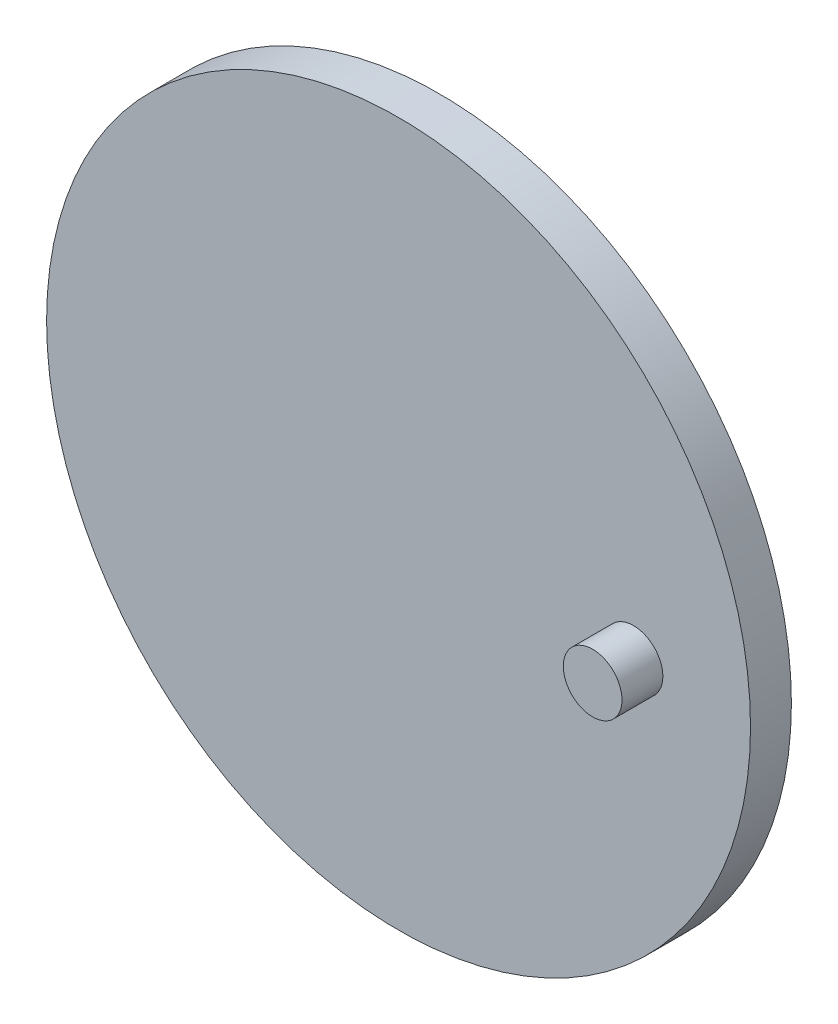
ISO-10303-21;
HEADER;
FILE_DESCRIPTION(('STEP AP214'),'2;1');
FILE_NAME('part.step','',(''),(''),'','','');
FILE_SCHEMA(('AUTOMOTIVE_DESIGN { 1 0 10303 214 1 1 1 1 }'));
ENDSEC;
DATA;
#1=APPLICATION_CONTEXT('core data for automotive mechanical design processes');
#2=APPLICATION_PROTOCOL_DEFINITION('international standard','automotive_design',2000,#1);
#3=PRODUCT_CONTEXT('',#1,'mechanical');
#4=PRODUCT('Part','Part','',(#3));
#5=PRODUCT_RELATED_PRODUCT_CATEGORY('part','',(#4));
#6=PRODUCT_DEFINITION_FORMATION('','',#4);
#7=PRODUCT_DEFINITION_CONTEXT('part definition',#1,'design');
#8=PRODUCT_DEFINITION('design','',#6,#7);
#9=PRODUCT_DEFINITION_SHAPE('','',#8);
#10=(LENGTH_UNIT() NAMED_UNIT(*) SI_UNIT(.MILLI.,.METRE.));
#11=(NAMED_UNIT(*) PLANE_ANGLE_UNIT() SI_UNIT($,.RADIAN.));
#12=(NAMED_UNIT(*) SI_UNIT($,.STERADIAN.) SOLID_ANGLE_UNIT());
#13=UNCERTAINTY_MEASURE_WITH_UNIT(LENGTH_MEASURE(1.E-05),#10,'distance_accuracy_value','');
#14=(GEOMETRIC_REPRESENTATION_CONTEXT(3) GLOBAL_UNCERTAINTY_ASSIGNED_CONTEXT((#13)) GLOBAL_UNIT_ASSIGNED_CONTEXT((#10,
#11,#12)) REPRESENTATION_CONTEXT('',''));
#15=CARTESIAN_POINT('',(0.,0.,0.));
#16=DIRECTION('',(0.,0.,1.));
#17=DIRECTION('',(1.,0.,0.));
#18=AXIS2_PLACEMENT_3D('',#15,#16,#17);
#19=CARTESIAN_POINT('',(0.,0.,5.));
#20=DIRECTION('',(0.,0.,-1.));
#21=DIRECTION('',(-1.,0.,0.));
#22=AXIS2_PLACEMENT_3D('',#19,#20,#21);
#23=CYLINDRICAL_SURFACE('',#22,43.0443108638609);
#24=CARTESIAN_POINT('',(0.,0.,5.));
#25=DIRECTION('',(0.,0.,1.));
#26=DIRECTION('',(1.,0.,0.));
#27=AXIS2_PLACEMENT_3D('',#24,#25,#26);
#28=CIRCLE('',#27,43.0443108638609);
#29=CARTESIAN_POINT('',(43.0443108638609,0.,5.));
#30=VERTEX_POINT('',#29);
#31=EDGE_CURVE('E44',#30,#30,#28,.T.);
#32=ORIENTED_EDGE('',*,*,#31,.F.);
#33=EDGE_LOOP('',(#32));
#34=FACE_BOUND('',#33,.T.);
#35=CARTESIAN_POINT('',(0.,0.,0.));
#36=DIRECTION('',(0.,0.,1.));
#37=DIRECTION('',(1.,0.,0.));
#38=AXIS2_PLACEMENT_3D('',#35,#36,#37);
#39=CIRCLE('',#38,43.0443108638609);
#40=CARTESIAN_POINT('',(43.0443108638609,0.,0.));
#41=VERTEX_POINT('',#40);
#42=EDGE_CURVE('E40',#41,#41,#39,.T.);
#43=ORIENTED_EDGE('',*,*,#42,.T.);
#44=EDGE_LOOP('',(#43));
#45=FACE_BOUND('',#44,.T.);
#46=ADVANCED_FACE('F37',(#34,#45),#23,.T.);
#47=CARTESIAN_POINT('',(0.,0.,5.));
#48=DIRECTION('',(0.,0.,1.));
#49=DIRECTION('',(1.,0.,0.));
#50=AXIS2_PLACEMENT_3D('',#47,#48,#49);
#51=PLANE('',#50);
#52=CARTESIAN_POINT('',(28.7351824097438,0.,5.));
#53=DIRECTION('',(0.,0.,1.));
#54=DIRECTION('',(1.,0.,0.));
#55=AXIS2_PLACEMENT_3D('',#52,#53,#54);
#56=CIRCLE('',#55,3.58904681452832);
#57=CARTESIAN_POINT('',(32.3242292242721,0.,5.));
#58=VERTEX_POINT('',#57);
#59=EDGE_CURVE('E55',#58,#58,#56,.T.);
#60=ORIENTED_EDGE('',*,*,#59,.F.);
#61=EDGE_LOOP('',(#60));
#62=FACE_BOUND('',#61,.T.);
#63=ORIENTED_EDGE('',*,*,#31,.T.);
#64=EDGE_LOOP('',(#63));
#65=FACE_BOUND('',#64,.T.);
#66=ADVANCED_FACE('F77',(#62,#65),#51,.T.);
#67=CARTESIAN_POINT('',(0.,0.,0.));
#68=DIRECTION('',(0.,0.,1.));
#69=DIRECTION('',(1.,0.,0.));
#70=AXIS2_PLACEMENT_3D('',#67,#68,#69);
#71=PLANE('',#70);
#72=CARTESIAN_POINT('',(0.,0.,0.));
#73=DIRECTION('',(0.,0.,-1.));
#74=DIRECTION('',(-1.,0.,0.));
#75=AXIS2_PLACEMENT_3D('',#72,#73,#74);
#76=CIRCLE('',#75,13.0443108638609);
#77=CARTESIAN_POINT('',(-13.0443108638609,0.,0.));
#78=VERTEX_POINT('',#77);
#79=EDGE_CURVE('E10',#78,#78,#76,.T.);
#80=ORIENTED_EDGE('',*,*,#79,.F.);
#81=EDGE_LOOP('',(#80));
#82=FACE_BOUND('',#81,.T.);
#83=ORIENTED_EDGE('',*,*,#42,.F.);
#84=EDGE_LOOP('',(#83));
#85=FACE_BOUND('',#84,.T.);
#86=ADVANCED_FACE('F82',(#82,#85),#71,.F.);
#87=CARTESIAN_POINT('',(28.7351824097438,0.,10.));
#88=DIRECTION('',(0.,0.,-1.));
#89=DIRECTION('',(-1.,0.,0.));
#90=AXIS2_PLACEMENT_3D('',#87,#88,#89);
#91=CYLINDRICAL_SURFACE('',#90,3.58904681452832);
#92=CARTESIAN_POINT('',(28.7351824097438,0.,10.));
#93=DIRECTION('',(0.,0.,1.));
#94=DIRECTION('',(1.,0.,0.));
#95=AXIS2_PLACEMENT_3D('',#92,#93,#94);
#96=CIRCLE('',#95,3.58904681452832);
#97=CARTESIAN_POINT('',(32.3242292242721,0.,10.));
#98=VERTEX_POINT('',#97);
#99=EDGE_CURVE('E52',#98,#98,#96,.T.);
#100=ORIENTED_EDGE('',*,*,#99,.F.);
#101=EDGE_LOOP('',(#100));
#102=FACE_BOUND('',#101,.T.);
#103=ORIENTED_EDGE('',*,*,#59,.T.);
#104=EDGE_LOOP('',(#103));
#105=FACE_BOUND('',#104,.T.);
#106=ADVANCED_FACE('F73',(#102,#105),#91,.T.);
#107=CARTESIAN_POINT('',(28.7351824097438,0.,10.));
#108=DIRECTION('',(0.,0.,1.));
#109=DIRECTION('',(1.,0.,0.));
#110=AXIS2_PLACEMENT_3D('',#107,#108,#109);
#111=PLANE('',#110);
#112=ORIENTED_EDGE('',*,*,#99,.T.);
#113=EDGE_LOOP('',(#112));
#114=FACE_BOUND('',#113,.T.);
#115=ADVANCED_FACE('F66',(#114),#111,.T.);
#116=CARTESIAN_POINT('',(0.,0.,-5.));
#117=DIRECTION('',(0.,0.,1.));
#118=DIRECTION('',(1.,0.,0.));
#119=AXIS2_PLACEMENT_3D('',#116,#117,#118);
#120=CYLINDRICAL_SURFACE('',#119,13.0443108638609);
#121=CARTESIAN_POINT('',(0.,0.,-5.));
#122=DIRECTION('',(0.,0.,-1.));
#123=DIRECTION('',(-1.,0.,0.));
#124=AXIS2_PLACEMENT_3D('',#121,#122,#123);
#125=CIRCLE('',#124,13.0443108638609);
#126=CARTESIAN_POINT('',(-13.0443108638609,0.,-5.));
#127=VERTEX_POINT('',#126);
#128=EDGE_CURVE('E51',#127,#127,#125,.T.);
#129=ORIENTED_EDGE('',*,*,#128,.F.);
#130=EDGE_LOOP('',(#129));
#131=FACE_BOUND('',#130,.T.);
#132=ORIENTED_EDGE('',*,*,#79,.T.);
#133=EDGE_LOOP('',(#132));
#134=FACE_BOUND('',#133,.T.);
#135=ADVANCED_FACE('F64',(#131,#134),#120,.T.);
#136=CARTESIAN_POINT('',(0.,0.,-5.));
#137=DIRECTION('',(0.,0.,-1.));
#138=DIRECTION('',(-1.,0.,0.));
#139=AXIS2_PLACEMENT_3D('',#136,#137,#138);
#140=PLANE('',#139);
#141=ORIENTED_EDGE('',*,*,#128,.T.);
#142=EDGE_LOOP('',(#141));
#143=FACE_BOUND('',#142,.T.);
#144=ADVANCED_FACE('F62',(#143),#140,.T.);
#145=CLOSED_SHELL('',(#46,#66,#86,#106,#115,#135,#144));
#146=MANIFOLD_SOLID_BREP('B2',#145);
#147=ADVANCED_BREP_SHAPE_REPRESENTATION('',(#18,#146),#14);
#148=SHAPE_DEFINITION_REPRESENTATION(#9,#147);
ENDSEC;
END-ISO-10303-21;
